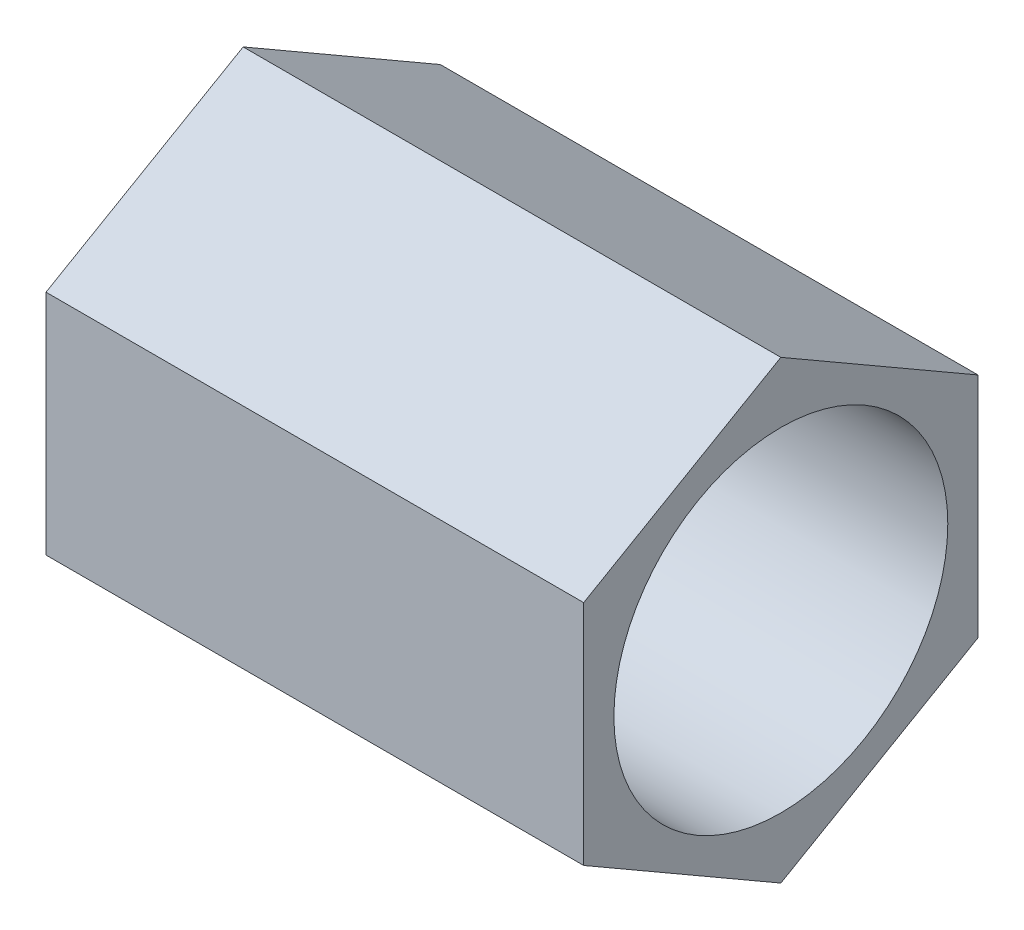
ISO-10303-21;
HEADER;
FILE_DESCRIPTION(('STEP AP214'),'2;1');
FILE_NAME('part.step','',(''),(''),'','','');
FILE_SCHEMA(('AUTOMOTIVE_DESIGN { 1 0 10303 214 1 1 1 1 }'));
ENDSEC;
DATA;
#1=APPLICATION_CONTEXT('core data for automotive mechanical design processes');
#2=APPLICATION_PROTOCOL_DEFINITION('international standard','automotive_design',2000,#1);
#3=PRODUCT_CONTEXT('',#1,'mechanical');
#4=PRODUCT('Part','Part','',(#3));
#5=PRODUCT_RELATED_PRODUCT_CATEGORY('part','',(#4));
#6=PRODUCT_DEFINITION_FORMATION('','',#4);
#7=PRODUCT_DEFINITION_CONTEXT('part definition',#1,'design');
#8=PRODUCT_DEFINITION('design','',#6,#7);
#9=PRODUCT_DEFINITION_SHAPE('','',#8);
#10=(LENGTH_UNIT() NAMED_UNIT(*) SI_UNIT(.MILLI.,.METRE.));
#11=(NAMED_UNIT(*) PLANE_ANGLE_UNIT() SI_UNIT($,.RADIAN.));
#12=(NAMED_UNIT(*) SI_UNIT($,.STERADIAN.) SOLID_ANGLE_UNIT());
#13=UNCERTAINTY_MEASURE_WITH_UNIT(LENGTH_MEASURE(1.E-05),#10,'distance_accuracy_value','');
#14=(GEOMETRIC_REPRESENTATION_CONTEXT(3) GLOBAL_UNCERTAINTY_ASSIGNED_CONTEXT((#13)) GLOBAL_UNIT_ASSIGNED_CONTEXT((#10,
#11,#12)) REPRESENTATION_CONTEXT('',''));
#15=CARTESIAN_POINT('',(0.,0.,0.));
#16=DIRECTION('',(0.,0.,1.));
#17=DIRECTION('',(1.,0.,0.));
#18=AXIS2_PLACEMENT_3D('',#15,#16,#17);
#19=CARTESIAN_POINT('',(15.,13.5,0.));
#20=DIRECTION('',(-1.,0.,0.));
#21=DIRECTION('',(0.,0.,1.));
#22=AXIS2_PLACEMENT_3D('',#19,#20,#21);
#23=PLANE('',#22);
#24=CARTESIAN_POINT('',(15.,0.,0.));
#25=DIRECTION('',(-1.,0.,0.));
#26=DIRECTION('',(0.,0.,1.));
#27=AXIS2_PLACEMENT_3D('',#24,#25,#26);
#28=CIRCLE('',#27,9.315);
#29=CARTESIAN_POINT('',(15.,0.,9.315));
#30=VERTEX_POINT('',#29);
#31=EDGE_CURVE('E137',#30,#30,#28,.T.);
#32=ORIENTED_EDGE('',*,*,#31,.T.);
#33=EDGE_LOOP('',(#32));
#34=FACE_BOUND('',#33,.T.);
#35=DIRECTION('',(0.,-0.499999999999998,-0.86602540378444));
#36=VECTOR('',#35,1.);
#37=CARTESIAN_POINT('',(15.,14.6252989552216,3.33176086632788));
#38=LINE('',#37,#36);
#39=CARTESIAN_POINT('',(15.,12.7017059221718,0.));
#40=VERTEX_POINT('',#39);
#41=CARTESIAN_POINT('',(15.,6.3508529610859,-11.));
#42=VERTEX_POINT('',#41);
#43=EDGE_CURVE('E58',#40,#42,#38,.T.);
#44=ORIENTED_EDGE('',*,*,#43,.F.);
#45=DIRECTION('',(0.,0.500000000000004,-0.866025403784436));
#46=VECTOR('',#45,1.);
#47=CARTESIAN_POINT('',(15.,4.42725992803598,14.3317608663279));
#48=LINE('',#47,#46);
#49=CARTESIAN_POINT('',(15.,6.35085296108583,11.));
#50=VERTEX_POINT('',#49);
#51=EDGE_CURVE('E123',#50,#40,#48,.T.);
#52=ORIENTED_EDGE('',*,*,#51,.F.);
#53=DIRECTION('',(0.,1.,0.));
#54=VECTOR('',#53,1.);
#55=CARTESIAN_POINT('',(15.,-10.1980390271856,10.9999999999999));
#56=LINE('',#55,#54);
#57=CARTESIAN_POINT('',(15.,-6.35085296108597,11.));
#58=VERTEX_POINT('',#57);
#59=EDGE_CURVE('E115',#58,#50,#56,.T.);
#60=ORIENTED_EDGE('',*,*,#59,.F.);
#61=DIRECTION('',(0.,0.499999999999992,0.866025403784443));
#62=VECTOR('',#61,1.);
#63=CARTESIAN_POINT('',(15.,-14.6252989552216,-3.33176086632798));
#64=LINE('',#63,#62);
#65=CARTESIAN_POINT('',(15.,-12.7017059221718,-1.35525271560688E-13));
#66=VERTEX_POINT('',#65);
#67=EDGE_CURVE('E97',#66,#58,#64,.T.);
#68=ORIENTED_EDGE('',*,*,#67,.F.);
#69=DIRECTION('',(0.,-0.50000000000001,0.866025403784433));
#70=VECTOR('',#69,1.);
#71=CARTESIAN_POINT('',(15.,-4.42725992803588,-14.3317608663279));
#72=LINE('',#71,#70);
#73=CARTESIAN_POINT('',(15.,-6.3508529610858,-11.));
#74=VERTEX_POINT('',#73);
#75=EDGE_CURVE('E101',#74,#66,#72,.T.);
#76=ORIENTED_EDGE('',*,*,#75,.F.);
#77=DIRECTION('',(0.,-1.,0.));
#78=VECTOR('',#77,1.);
#79=CARTESIAN_POINT('',(15.,10.1980390271856,-11.));
#80=LINE('',#79,#78);
#81=EDGE_CURVE('E131',#42,#74,#80,.T.);
#82=ORIENTED_EDGE('',*,*,#81,.F.);
#83=EDGE_LOOP('',(#44,#52,#60,#68,#76,#82));
#84=FACE_BOUND('',#83,.T.);
#85=ADVANCED_FACE('F35',(#34,#84),#23,.F.);
#86=CARTESIAN_POINT('',(-15.,13.5,0.));
#87=DIRECTION('',(1.,0.,0.));
#88=DIRECTION('',(0.,0.,-1.));
#89=AXIS2_PLACEMENT_3D('',#86,#87,#88);
#90=PLANE('',#89);
#91=CARTESIAN_POINT('',(-15.,0.,0.));
#92=DIRECTION('',(-1.,0.,0.));
#93=DIRECTION('',(0.,0.,1.));
#94=AXIS2_PLACEMENT_3D('',#91,#92,#93);
#95=CIRCLE('',#94,9.315);
#96=CARTESIAN_POINT('',(-15.,0.,9.315));
#97=VERTEX_POINT('',#96);
#98=EDGE_CURVE('E134',#97,#97,#95,.T.);
#99=ORIENTED_EDGE('',*,*,#98,.F.);
#100=EDGE_LOOP('',(#99));
#101=FACE_BOUND('',#100,.T.);
#102=DIRECTION('',(0.,-0.499999999999998,-0.86602540378444));
#103=VECTOR('',#102,1.);
#104=CARTESIAN_POINT('',(-15.,14.6252989552216,3.33176086632788));
#105=LINE('',#104,#103);
#106=CARTESIAN_POINT('',(-15.,12.7017059221718,0.));
#107=VERTEX_POINT('',#106);
#108=CARTESIAN_POINT('',(-15.,6.3508529610859,-11.));
#109=VERTEX_POINT('',#108);
#110=EDGE_CURVE('E128',#107,#109,#105,.T.);
#111=ORIENTED_EDGE('',*,*,#110,.T.);
#112=DIRECTION('',(0.,1.,0.));
#113=VECTOR('',#112,1.);
#114=CARTESIAN_POINT('',(-15.,13.5,-11.));
#115=LINE('',#114,#113);
#116=CARTESIAN_POINT('',(-15.,-6.3508529610858,-11.));
#117=VERTEX_POINT('',#116);
#118=EDGE_CURVE('E107',#117,#109,#115,.T.);
#119=ORIENTED_EDGE('',*,*,#118,.F.);
#120=DIRECTION('',(0.,-0.50000000000001,0.866025403784433));
#121=VECTOR('',#120,1.);
#122=CARTESIAN_POINT('',(-15.,-4.42725992803588,-14.3317608663279));
#123=LINE('',#122,#121);
#124=CARTESIAN_POINT('',(-15.,-12.7017059221718,-1.33573707650214E-13));
#125=VERTEX_POINT('',#124);
#126=EDGE_CURVE('E50',#117,#125,#123,.T.);
#127=ORIENTED_EDGE('',*,*,#126,.T.);
#128=DIRECTION('',(0.,0.499999999999992,0.866025403784443));
#129=VECTOR('',#128,1.);
#130=CARTESIAN_POINT('',(-15.,-14.6252989552216,-3.33176086632798));
#131=LINE('',#130,#129);
#132=CARTESIAN_POINT('',(-15.,-6.35085296108599,10.9999999999999));
#133=VERTEX_POINT('',#132);
#134=EDGE_CURVE('E89',#125,#133,#131,.T.);
#135=ORIENTED_EDGE('',*,*,#134,.T.);
#136=DIRECTION('',(0.,1.,0.));
#137=VECTOR('',#136,1.);
#138=CARTESIAN_POINT('',(-15.,-10.1980390271856,10.9999999999999));
#139=LINE('',#138,#137);
#140=CARTESIAN_POINT('',(-15.,6.35085296108583,11.));
#141=VERTEX_POINT('',#140);
#142=EDGE_CURVE('E113',#133,#141,#139,.T.);
#143=ORIENTED_EDGE('',*,*,#142,.T.);
#144=DIRECTION('',(0.,0.500000000000004,-0.866025403784436));
#145=VECTOR('',#144,1.);
#146=CARTESIAN_POINT('',(-15.,4.42725992803598,14.3317608663279));
#147=LINE('',#146,#145);
#148=EDGE_CURVE('E120',#141,#107,#147,.T.);
#149=ORIENTED_EDGE('',*,*,#148,.T.);
#150=EDGE_LOOP('',(#111,#119,#127,#135,#143,#149));
#151=FACE_BOUND('',#150,.T.);
#152=ADVANCED_FACE('F105',(#101,#151),#90,.F.);
#153=CARTESIAN_POINT('',(15.,10.1980390271856,-11.));
#154=DIRECTION('',(0.,0.,-1.));
#155=DIRECTION('',(-1.,0.,0.));
#156=AXIS2_PLACEMENT_3D('',#153,#154,#155);
#157=PLANE('',#156);
#158=ORIENTED_EDGE('',*,*,#118,.T.);
#159=DIRECTION('',(1.,0.,0.));
#160=VECTOR('',#159,1.);
#161=CARTESIAN_POINT('',(15.,6.3508529610859,-11.));
#162=LINE('',#161,#160);
#163=EDGE_CURVE('E11',#109,#42,#162,.T.);
#164=ORIENTED_EDGE('',*,*,#163,.T.);
#165=ORIENTED_EDGE('',*,*,#81,.T.);
#166=DIRECTION('',(-1.,0.,0.));
#167=VECTOR('',#166,1.);
#168=CARTESIAN_POINT('',(15.,-6.3508529610858,-11.));
#169=LINE('',#168,#167);
#170=EDGE_CURVE('E43',#74,#117,#169,.T.);
#171=ORIENTED_EDGE('',*,*,#170,.T.);
#172=EDGE_LOOP('',(#158,#164,#165,#171));
#173=FACE_BOUND('',#172,.T.);
#174=ADVANCED_FACE('F141',(#173),#157,.T.);
#175=CARTESIAN_POINT('',(-12.8257453814815,0.,0.));
#176=DIRECTION('',(-1.,0.,0.));
#177=DIRECTION('',(0.,0.,1.));
#178=AXIS2_PLACEMENT_3D('',#175,#176,#177);
#179=CYLINDRICAL_SURFACE('',#178,9.315);
#180=ORIENTED_EDGE('',*,*,#31,.F.);
#181=EDGE_LOOP('',(#180));
#182=FACE_BOUND('',#181,.T.);
#183=ORIENTED_EDGE('',*,*,#98,.T.);
#184=EDGE_LOOP('',(#183));
#185=FACE_BOUND('',#184,.T.);
#186=ADVANCED_FACE('F37',(#182,#185),#179,.F.);
#187=CARTESIAN_POINT('',(15.,14.6252989552216,3.33176086632788));
#188=DIRECTION('',(0.,0.86602540378444,-0.499999999999998));
#189=DIRECTION('',(0.,0.499999999999998,0.86602540378444));
#190=AXIS2_PLACEMENT_3D('',#187,#188,#189);
#191=PLANE('',#190);
#192=ORIENTED_EDGE('',*,*,#110,.F.);
#193=DIRECTION('',(1.,0.,0.));
#194=VECTOR('',#193,1.);
#195=CARTESIAN_POINT('',(15.,12.7017059221718,0.));
#196=LINE('',#195,#194);
#197=EDGE_CURVE('E126',#107,#40,#196,.T.);
#198=ORIENTED_EDGE('',*,*,#197,.T.);
#199=ORIENTED_EDGE('',*,*,#43,.T.);
#200=ORIENTED_EDGE('',*,*,#163,.F.);
#201=EDGE_LOOP('',(#192,#198,#199,#200));
#202=FACE_BOUND('',#201,.T.);
#203=ADVANCED_FACE('F152',(#202),#191,.T.);
#204=CARTESIAN_POINT('',(15.,4.42725992803598,14.3317608663279));
#205=DIRECTION('',(0.,0.866025403784436,0.500000000000004));
#206=DIRECTION('',(0.,-0.500000000000004,0.866025403784436));
#207=AXIS2_PLACEMENT_3D('',#204,#205,#206);
#208=PLANE('',#207);
#209=ORIENTED_EDGE('',*,*,#148,.F.);
#210=DIRECTION('',(1.,0.,0.));
#211=VECTOR('',#210,1.);
#212=CARTESIAN_POINT('',(15.,6.35085296108583,11.));
#213=LINE('',#212,#211);
#214=EDGE_CURVE('E118',#141,#50,#213,.T.);
#215=ORIENTED_EDGE('',*,*,#214,.T.);
#216=ORIENTED_EDGE('',*,*,#51,.T.);
#217=ORIENTED_EDGE('',*,*,#197,.F.);
#218=EDGE_LOOP('',(#209,#215,#216,#217));
#219=FACE_BOUND('',#218,.T.);
#220=ADVANCED_FACE('F151',(#219),#208,.T.);
#221=CARTESIAN_POINT('',(15.,-10.1980390271856,10.9999999999999));
#222=DIRECTION('',(0.,0.,1.));
#223=DIRECTION('',(0.,-1.,0.));
#224=AXIS2_PLACEMENT_3D('',#221,#222,#223);
#225=PLANE('',#224);
#226=ORIENTED_EDGE('',*,*,#142,.F.);
#227=DIRECTION('',(1.,0.,0.));
#228=VECTOR('',#227,1.);
#229=CARTESIAN_POINT('',(15.,-6.35085296108597,11.));
#230=LINE('',#229,#228);
#231=EDGE_CURVE('E94',#133,#58,#230,.T.);
#232=ORIENTED_EDGE('',*,*,#231,.T.);
#233=ORIENTED_EDGE('',*,*,#59,.T.);
#234=ORIENTED_EDGE('',*,*,#214,.F.);
#235=EDGE_LOOP('',(#226,#232,#233,#234));
#236=FACE_BOUND('',#235,.T.);
#237=ADVANCED_FACE('F148',(#236),#225,.T.);
#238=CARTESIAN_POINT('',(15.,-14.6252989552216,-3.33176086632798));
#239=DIRECTION('',(0.,-0.866025403784443,0.499999999999992));
#240=DIRECTION('',(0.,-0.499999999999992,-0.866025403784443));
#241=AXIS2_PLACEMENT_3D('',#238,#239,#240);
#242=PLANE('',#241);
#243=ORIENTED_EDGE('',*,*,#134,.F.);
#244=DIRECTION('',(1.,0.,0.));
#245=VECTOR('',#244,1.);
#246=CARTESIAN_POINT('',(15.,-12.7017059221718,-1.35308431126191E-13));
#247=LINE('',#246,#245);
#248=EDGE_CURVE('E92',#125,#66,#247,.T.);
#249=ORIENTED_EDGE('',*,*,#248,.T.);
#250=ORIENTED_EDGE('',*,*,#67,.T.);
#251=ORIENTED_EDGE('',*,*,#231,.F.);
#252=EDGE_LOOP('',(#243,#249,#250,#251));
#253=FACE_BOUND('',#252,.T.);
#254=ADVANCED_FACE('F90',(#253),#242,.T.);
#255=CARTESIAN_POINT('',(15.,-4.42725992803588,-14.3317608663279));
#256=DIRECTION('',(0.,-0.866025403784433,-0.50000000000001));
#257=DIRECTION('',(0.,0.50000000000001,-0.866025403784433));
#258=AXIS2_PLACEMENT_3D('',#255,#256,#257);
#259=PLANE('',#258);
#260=ORIENTED_EDGE('',*,*,#75,.T.);
#261=ORIENTED_EDGE('',*,*,#248,.F.);
#262=ORIENTED_EDGE('',*,*,#126,.F.);
#263=ORIENTED_EDGE('',*,*,#170,.F.);
#264=EDGE_LOOP('',(#260,#261,#262,#263));
#265=FACE_BOUND('',#264,.T.);
#266=ADVANCED_FACE('F99',(#265),#259,.T.);
#267=CLOSED_SHELL('',(#85,#152,#174,#186,#203,#220,#237,#254,#266));
#268=MANIFOLD_SOLID_BREP('B2',#267);
#269=ADVANCED_BREP_SHAPE_REPRESENTATION('',(#18,#268),#14);
#270=SHAPE_DEFINITION_REPRESENTATION(#9,#269);
ENDSEC;
END-ISO-10303-21;
